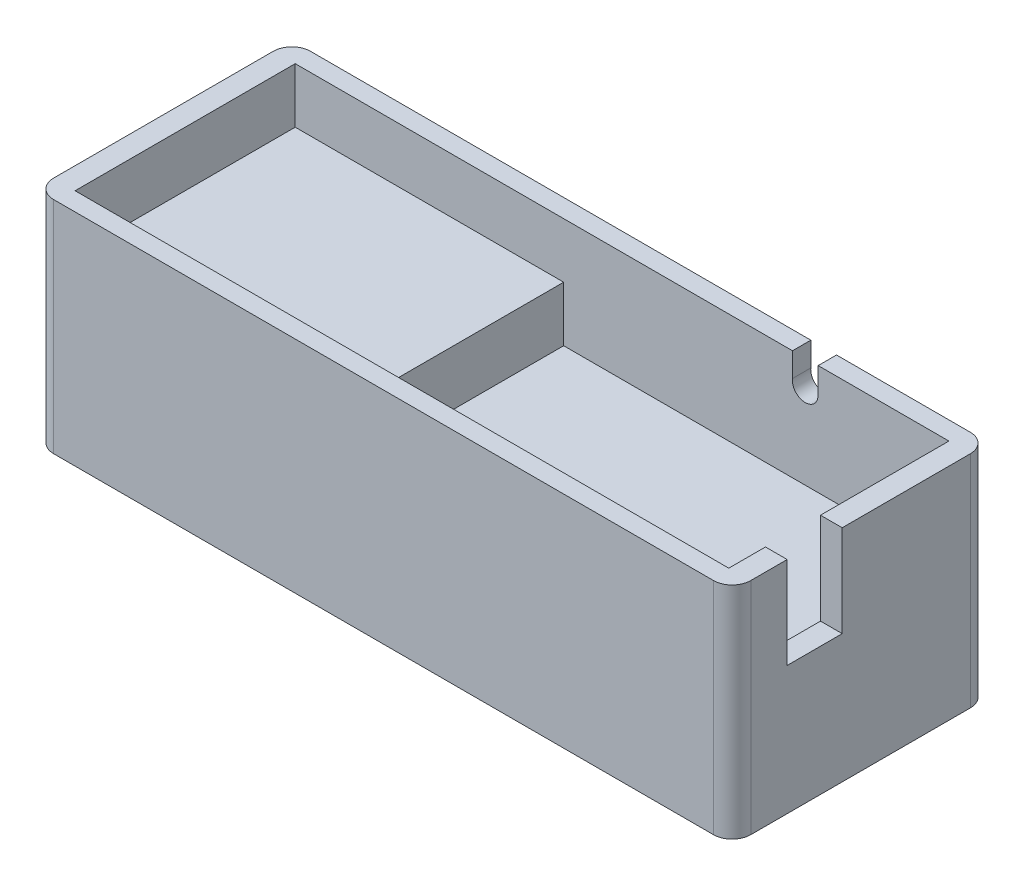
ISO-10303-21;
HEADER;
FILE_DESCRIPTION(('STEP AP214'),'2;1');
FILE_NAME('part.step','',(''),(''),'','','');
FILE_SCHEMA(('AUTOMOTIVE_DESIGN { 1 0 10303 214 1 1 1 1 }'));
ENDSEC;
DATA;
#1=APPLICATION_CONTEXT('core data for automotive mechanical design processes');
#2=APPLICATION_PROTOCOL_DEFINITION('international standard','automotive_design',2000,#1);
#3=PRODUCT_CONTEXT('',#1,'mechanical');
#4=PRODUCT('Part','Part','',(#3));
#5=PRODUCT_RELATED_PRODUCT_CATEGORY('part','',(#4));
#6=PRODUCT_DEFINITION_FORMATION('','',#4);
#7=PRODUCT_DEFINITION_CONTEXT('part definition',#1,'design');
#8=PRODUCT_DEFINITION('design','',#6,#7);
#9=PRODUCT_DEFINITION_SHAPE('','',#8);
#10=(LENGTH_UNIT() NAMED_UNIT(*) SI_UNIT(.MILLI.,.METRE.));
#11=(NAMED_UNIT(*) PLANE_ANGLE_UNIT() SI_UNIT($,.RADIAN.));
#12=(NAMED_UNIT(*) SI_UNIT($,.STERADIAN.) SOLID_ANGLE_UNIT());
#13=UNCERTAINTY_MEASURE_WITH_UNIT(LENGTH_MEASURE(1.E-05),#10,'distance_accuracy_value','');
#14=(GEOMETRIC_REPRESENTATION_CONTEXT(3) GLOBAL_UNCERTAINTY_ASSIGNED_CONTEXT((#13)) GLOBAL_UNIT_ASSIGNED_CONTEXT((#10,
#11,#12)) REPRESENTATION_CONTEXT('',''));
#15=CARTESIAN_POINT('',(0.,0.,0.));
#16=DIRECTION('',(0.,0.,1.));
#17=DIRECTION('',(1.,0.,0.));
#18=AXIS2_PLACEMENT_3D('',#15,#16,#17);
#19=CARTESIAN_POINT('',(-89.0845522238805,9.99999999999999,30.));
#20=DIRECTION('',(0.,0.,1.));
#21=DIRECTION('',(1.,0.,0.));
#22=AXIS2_PLACEMENT_3D('',#19,#20,#21);
#23=PLANE('',#22);
#24=DIRECTION('',(0.,-1.,0.));
#25=VECTOR('',#24,1.);
#26=CARTESIAN_POINT('',(-15.9154477761194,45.,30.));
#27=LINE('',#26,#25);
#28=CARTESIAN_POINT('',(-15.9154477761194,45.,30.));
#29=VERTEX_POINT('',#28);
#30=CARTESIAN_POINT('',(-15.9154477761194,30.,30.));
#31=VERTEX_POINT('',#30);
#32=EDGE_CURVE('E50',#29,#31,#27,.T.);
#33=ORIENTED_EDGE('',*,*,#32,.F.);
#34=DIRECTION('',(1.,0.,0.));
#35=VECTOR('',#34,1.);
#36=CARTESIAN_POINT('',(-89.0845522238805,45.,30.));
#37=LINE('',#36,#35);
#38=CARTESIAN_POINT('',(-89.0845522238805,45.,30.));
#39=VERTEX_POINT('',#38);
#40=EDGE_CURVE('E257',#39,#29,#37,.T.);
#41=ORIENTED_EDGE('',*,*,#40,.F.);
#42=DIRECTION('',(0.,1.,0.));
#43=VECTOR('',#42,1.);
#44=CARTESIAN_POINT('',(-89.0845522238805,9.99999999999999,30.));
#45=LINE('',#44,#43);
#46=CARTESIAN_POINT('',(-89.0845522238805,60.,30.));
#47=VERTEX_POINT('',#46);
#48=EDGE_CURVE('E267',#39,#47,#45,.T.);
#49=ORIENTED_EDGE('',*,*,#48,.T.);
#50=DIRECTION('',(1.,0.,0.));
#51=VECTOR('',#50,1.);
#52=CARTESIAN_POINT('',(-89.0845522238805,60.,30.));
#53=LINE('',#52,#51);
#54=CARTESIAN_POINT('',(89.0845522238806,60.,30.));
#55=VERTEX_POINT('',#54);
#56=EDGE_CURVE('E287',#47,#55,#53,.T.);
#57=ORIENTED_EDGE('',*,*,#56,.T.);
#58=DIRECTION('',(0.,1.,0.));
#59=VECTOR('',#58,1.);
#60=CARTESIAN_POINT('',(89.0845522238806,9.99999999999999,30.));
#61=LINE('',#60,#59);
#62=CARTESIAN_POINT('',(89.0845522238806,30.,30.));
#63=VERTEX_POINT('',#62);
#64=EDGE_CURVE('E276',#63,#55,#61,.T.);
#65=ORIENTED_EDGE('',*,*,#64,.F.);
#66=DIRECTION('',(1.,0.,0.));
#67=VECTOR('',#66,1.);
#68=CARTESIAN_POINT('',(89.0845522238806,30.,30.));
#69=LINE('',#68,#67);
#70=CARTESIAN_POINT('',(8.25151735382582,30.,30.));
#71=VERTEX_POINT('',#70);
#72=EDGE_CURVE('E479',#71,#63,#69,.T.);
#73=ORIENTED_EDGE('',*,*,#72,.F.);
#74=DIRECTION('',(0.,1.,0.));
#75=VECTOR('',#74,1.);
#76=CARTESIAN_POINT('',(8.25151735382582,9.99999999999999,30.));
#77=LINE('',#76,#75);
#78=CARTESIAN_POINT('',(8.25151735382582,43.6453957438315,30.));
#79=VERTEX_POINT('',#78);
#80=EDGE_CURVE('E379',#71,#79,#77,.T.);
#81=ORIENTED_EDGE('',*,*,#80,.T.);
#82=DIRECTION('',(-1.,0.,0.));
#83=VECTOR('',#82,1.);
#84=CARTESIAN_POINT('',(-89.0845522238805,43.6453957438315,30.));
#85=LINE('',#84,#83);
#86=CARTESIAN_POINT('',(-13.0462053971087,43.6453957438315,30.));
#87=VERTEX_POINT('',#86);
#88=EDGE_CURVE('E11',#79,#87,#85,.T.);
#89=ORIENTED_EDGE('',*,*,#88,.T.);
#90=DIRECTION('',(0.,-1.,0.));
#91=VECTOR('',#90,1.);
#92=CARTESIAN_POINT('',(-13.0462053971087,9.99999999999999,30.));
#93=LINE('',#92,#91);
#94=CARTESIAN_POINT('',(-13.0462053971087,30.,30.));
#95=VERTEX_POINT('',#94);
#96=EDGE_CURVE('E389',#87,#95,#93,.T.);
#97=ORIENTED_EDGE('',*,*,#96,.T.);
#98=EDGE_CURVE('E394',#31,#95,#69,.T.);
#99=ORIENTED_EDGE('',*,*,#98,.F.);
#100=EDGE_LOOP('',(#33,#41,#49,#57,#65,#73,#81,#89,#97,#99));
#101=FACE_BOUND('',#100,.T.);
#102=ADVANCED_FACE('F35',(#101),#23,.F.);
#103=CARTESIAN_POINT('',(-89.0845522238805,9.99999999999999,-30.));
#104=DIRECTION('',(0.,0.,-1.));
#105=DIRECTION('',(-1.,0.,0.));
#106=AXIS2_PLACEMENT_3D('',#103,#104,#105);
#107=PLANE('',#106);
#108=DIRECTION('',(0.,-1.,0.));
#109=VECTOR('',#108,1.);
#110=CARTESIAN_POINT('',(-15.9154477761194,45.,-30.));
#111=LINE('',#110,#109);
#112=CARTESIAN_POINT('',(-15.9154477761194,45.,-30.));
#113=VERTEX_POINT('',#112);
#114=CARTESIAN_POINT('',(-15.9154477761194,30.,-30.));
#115=VERTEX_POINT('',#114);
#116=EDGE_CURVE('E509',#113,#115,#111,.T.);
#117=ORIENTED_EDGE('',*,*,#116,.T.);
#118=DIRECTION('',(-1.,0.,0.));
#119=VECTOR('',#118,1.);
#120=CARTESIAN_POINT('',(89.0845522238806,30.,-30.));
#121=LINE('',#120,#119);
#122=CARTESIAN_POINT('',(89.0845522238806,30.,-30.));
#123=VERTEX_POINT('',#122);
#124=EDGE_CURVE('E477',#123,#115,#121,.T.);
#125=ORIENTED_EDGE('',*,*,#124,.F.);
#126=DIRECTION('',(0.,1.,0.));
#127=VECTOR('',#126,1.);
#128=CARTESIAN_POINT('',(89.0845522238806,9.99999999999999,-30.));
#129=LINE('',#128,#127);
#130=CARTESIAN_POINT('',(89.0845522238806,60.,-30.));
#131=VERTEX_POINT('',#130);
#132=EDGE_CURVE('E281',#123,#131,#129,.T.);
#133=ORIENTED_EDGE('',*,*,#132,.T.);
#134=DIRECTION('',(-1.,0.,0.));
#135=VECTOR('',#134,1.);
#136=CARTESIAN_POINT('',(-89.0845522238805,60.,-30.));
#137=LINE('',#136,#135);
#138=CARTESIAN_POINT('',(53.4495066360603,60.,-30.));
#139=VERTEX_POINT('',#138);
#140=EDGE_CURVE('E487',#131,#139,#137,.T.);
#141=ORIENTED_EDGE('',*,*,#140,.T.);
#142=DIRECTION('',(0.,1.,0.));
#143=VECTOR('',#142,1.);
#144=CARTESIAN_POINT('',(53.4495066360603,53.0700154630988,-30.));
#145=LINE('',#144,#143);
#146=CARTESIAN_POINT('',(53.4495066360603,53.0700154630988,-30.));
#147=VERTEX_POINT('',#146);
#148=EDGE_CURVE('E447',#147,#139,#145,.T.);
#149=ORIENTED_EDGE('',*,*,#148,.F.);
#150=DIRECTION('',(1.,0.,0.));
#151=VECTOR('',#150,1.);
#152=CARTESIAN_POINT('',(53.4495066360603,53.0700154630988,-30.));
#153=LINE('',#152,#151);
#154=CARTESIAN_POINT('',(53.419299620628,53.0700154630988,-30.));
#155=VERTEX_POINT('',#154);
#156=EDGE_CURVE('E442',#155,#147,#153,.T.);
#157=ORIENTED_EDGE('',*,*,#156,.F.);
#158=CARTESIAN_POINT('',(49.92,53.,-30.));
#159=DIRECTION('',(0.,0.,-1.));
#160=DIRECTION('',(-1.,0.,0.));
#161=AXIS2_PLACEMENT_3D('',#158,#159,#160);
#162=CIRCLE('',#161,3.5);
#163=CARTESIAN_POINT('',(46.4495066360603,53.4535149510773,-30.));
#164=VERTEX_POINT('',#163);
#165=EDGE_CURVE('E352',#155,#164,#162,.T.);
#166=ORIENTED_EDGE('',*,*,#165,.T.);
#167=DIRECTION('',(0.,1.,0.));
#168=VECTOR('',#167,1.);
#169=CARTESIAN_POINT('',(46.4495066360603,53.0700154630988,-30.));
#170=LINE('',#169,#168);
#171=CARTESIAN_POINT('',(46.4495066360603,60.,-30.));
#172=VERTEX_POINT('',#171);
#173=EDGE_CURVE('E450',#164,#172,#170,.T.);
#174=ORIENTED_EDGE('',*,*,#173,.T.);
#175=CARTESIAN_POINT('',(-89.0845522238805,60.,-30.));
#176=VERTEX_POINT('',#175);
#177=EDGE_CURVE('E486',#172,#176,#137,.T.);
#178=ORIENTED_EDGE('',*,*,#177,.T.);
#179=DIRECTION('',(0.,1.,0.));
#180=VECTOR('',#179,1.);
#181=CARTESIAN_POINT('',(-89.0845522238805,9.99999999999999,-30.));
#182=LINE('',#181,#180);
#183=CARTESIAN_POINT('',(-89.0845522238805,45.,-30.));
#184=VERTEX_POINT('',#183);
#185=EDGE_CURVE('E277',#184,#176,#182,.T.);
#186=ORIENTED_EDGE('',*,*,#185,.F.);
#187=DIRECTION('',(-1.,0.,0.));
#188=VECTOR('',#187,1.);
#189=CARTESIAN_POINT('',(-89.0845522238805,45.,-30.));
#190=LINE('',#189,#188);
#191=EDGE_CURVE('E259',#113,#184,#190,.T.);
#192=ORIENTED_EDGE('',*,*,#191,.F.);
#193=EDGE_LOOP('',(#117,#125,#133,#141,#149,#157,#166,#174,#178,#186,#192));
#194=FACE_BOUND('',#193,.T.);
#195=ADVANCED_FACE('F506',(#194),#107,.F.);
#196=CARTESIAN_POINT('',(0.,30.,0.));
#197=DIRECTION('',(0.,1.,0.));
#198=DIRECTION('',(0.,0.,1.));
#199=AXIS2_PLACEMENT_3D('',#196,#197,#198);
#200=PLANE('',#199);
#201=ORIENTED_EDGE('',*,*,#124,.T.);
#202=DIRECTION('',(0.,0.,-1.));
#203=VECTOR('',#202,1.);
#204=CARTESIAN_POINT('',(-15.9154477761194,30.,-30.));
#205=LINE('',#204,#203);
#206=EDGE_CURVE('E263',#31,#115,#205,.T.);
#207=ORIENTED_EDGE('',*,*,#206,.F.);
#208=ORIENTED_EDGE('',*,*,#98,.T.);
#209=DIRECTION('',(0.,0.,1.));
#210=VECTOR('',#209,1.);
#211=CARTESIAN_POINT('',(-13.0462053971087,30.,0.));
#212=LINE('',#211,#210);
#213=CARTESIAN_POINT('',(-13.0462053971087,30.,26.2840322014641));
#214=VERTEX_POINT('',#213);
#215=EDGE_CURVE('E364',#214,#95,#212,.T.);
#216=ORIENTED_EDGE('',*,*,#215,.F.);
#217=DIRECTION('',(-1.,0.,0.));
#218=VECTOR('',#217,1.);
#219=CARTESIAN_POINT('',(0.,30.,26.2840322014641));
#220=LINE('',#219,#218);
#221=CARTESIAN_POINT('',(8.25151735382582,30.,26.2840322014641));
#222=VERTEX_POINT('',#221);
#223=EDGE_CURVE('E367',#222,#214,#220,.T.);
#224=ORIENTED_EDGE('',*,*,#223,.F.);
#225=DIRECTION('',(0.,0.,-1.));
#226=VECTOR('',#225,1.);
#227=CARTESIAN_POINT('',(8.25151735382581,30.,0.));
#228=LINE('',#227,#226);
#229=EDGE_CURVE('E43',#71,#222,#228,.T.);
#230=ORIENTED_EDGE('',*,*,#229,.F.);
#231=ORIENTED_EDGE('',*,*,#72,.T.);
#232=DIRECTION('',(0.,0.,-1.));
#233=VECTOR('',#232,1.);
#234=CARTESIAN_POINT('',(89.0845522238806,30.,30.));
#235=LINE('',#234,#233);
#236=EDGE_CURVE('E475',#63,#123,#235,.T.);
#237=ORIENTED_EDGE('',*,*,#236,.T.);
#238=EDGE_LOOP('',(#201,#207,#208,#216,#224,#230,#231,#237));
#239=FACE_BOUND('',#238,.T.);
#240=ADVANCED_FACE('F393',(#239),#200,.T.);
#241=CARTESIAN_POINT('',(0.,60.,0.));
#242=DIRECTION('',(0.,1.,0.));
#243=DIRECTION('',(0.,0.,1.));
#244=AXIS2_PLACEMENT_3D('',#241,#242,#243);
#245=PLANE('',#244);
#246=DIRECTION('',(0.,0.,-1.));
#247=VECTOR('',#246,1.);
#248=CARTESIAN_POINT('',(53.4495066360603,60.,-30.));
#249=LINE('',#248,#247);
#250=CARTESIAN_POINT('',(53.4495066360603,60.,-35.));
#251=VERTEX_POINT('',#250);
#252=EDGE_CURVE('E429',#139,#251,#249,.T.);
#253=ORIENTED_EDGE('',*,*,#252,.F.);
#254=ORIENTED_EDGE('',*,*,#140,.F.);
#255=DIRECTION('',(0.,0.,-1.));
#256=VECTOR('',#255,1.);
#257=CARTESIAN_POINT('',(89.0845522238806,60.,30.));
#258=LINE('',#257,#256);
#259=CARTESIAN_POINT('',(89.0845522238806,60.,5.));
#260=VERTEX_POINT('',#259);
#261=EDGE_CURVE('E355',#260,#131,#258,.T.);
#262=ORIENTED_EDGE('',*,*,#261,.F.);
#263=DIRECTION('',(-1.,0.,0.));
#264=VECTOR('',#263,1.);
#265=CARTESIAN_POINT('',(0.,60.,5.));
#266=LINE('',#265,#264);
#267=CARTESIAN_POINT('',(95.,60.,5.));
#268=VERTEX_POINT('',#267);
#269=EDGE_CURVE('E471',#268,#260,#266,.T.);
#270=ORIENTED_EDGE('',*,*,#269,.F.);
#271=DIRECTION('',(0.,0.,1.));
#272=VECTOR('',#271,1.);
#273=CARTESIAN_POINT('',(95.,60.,-35.));
#274=LINE('',#273,#272);
#275=CARTESIAN_POINT('',(95.,60.,-29.92));
#276=VERTEX_POINT('',#275);
#277=EDGE_CURVE('E296',#276,#268,#274,.T.);
#278=ORIENTED_EDGE('',*,*,#277,.F.);
#279=CARTESIAN_POINT('',(89.92,60.,-29.92));
#280=DIRECTION('',(0.,1.,0.));
#281=DIRECTION('',(0.,0.,1.));
#282=AXIS2_PLACEMENT_3D('',#279,#280,#281);
#283=CIRCLE('',#282,5.08);
#284=CARTESIAN_POINT('',(89.92,60.,-35.));
#285=VERTEX_POINT('',#284);
#286=EDGE_CURVE('E333',#276,#285,#283,.T.);
#287=ORIENTED_EDGE('',*,*,#286,.T.);
#288=DIRECTION('',(1.,0.,0.));
#289=VECTOR('',#288,1.);
#290=CARTESIAN_POINT('',(-95.,60.,-35.));
#291=LINE('',#290,#289);
#292=EDGE_CURVE('E299',#251,#285,#291,.T.);
#293=ORIENTED_EDGE('',*,*,#292,.F.);
#294=EDGE_LOOP('',(#253,#254,#262,#270,#278,#287,#293));
#295=FACE_BOUND('',#294,.T.);
#296=ADVANCED_FACE('F615',(#295),#245,.T.);
#297=CARTESIAN_POINT('',(-95.,60.,-35.));
#298=DIRECTION('',(1.,0.,0.));
#299=DIRECTION('',(0.,0.,-1.));
#300=AXIS2_PLACEMENT_3D('',#297,#298,#299);
#301=PLANE('',#300);
#302=DIRECTION('',(0.,0.,1.));
#303=VECTOR('',#302,1.);
#304=CARTESIAN_POINT('',(-95.,0.,-35.));
#305=LINE('',#304,#303);
#306=CARTESIAN_POINT('',(-95.,0.,-29.92));
#307=VERTEX_POINT('',#306);
#308=CARTESIAN_POINT('',(-95.,0.,29.92));
#309=VERTEX_POINT('',#308);
#310=EDGE_CURVE('E279',#307,#309,#305,.T.);
#311=ORIENTED_EDGE('',*,*,#310,.T.);
#312=DIRECTION('',(0.,-1.,0.));
#313=VECTOR('',#312,1.);
#314=CARTESIAN_POINT('',(-95.,60.,29.92));
#315=LINE('',#314,#313);
#316=CARTESIAN_POINT('',(-95.,60.,29.92));
#317=VERTEX_POINT('',#316);
#318=EDGE_CURVE('E329',#309,#317,#315,.F.);
#319=ORIENTED_EDGE('',*,*,#318,.T.);
#320=DIRECTION('',(0.,0.,1.));
#321=VECTOR('',#320,1.);
#322=CARTESIAN_POINT('',(-95.,60.,-35.));
#323=LINE('',#322,#321);
#324=CARTESIAN_POINT('',(-95.,60.,-29.92));
#325=VERTEX_POINT('',#324);
#326=EDGE_CURVE('E288',#325,#317,#323,.T.);
#327=ORIENTED_EDGE('',*,*,#326,.F.);
#328=DIRECTION('',(0.,-1.,0.));
#329=VECTOR('',#328,1.);
#330=CARTESIAN_POINT('',(-95.,0.,-29.92));
#331=LINE('',#330,#329);
#332=EDGE_CURVE('E326',#325,#307,#331,.T.);
#333=ORIENTED_EDGE('',*,*,#332,.T.);
#334=EDGE_LOOP('',(#311,#319,#327,#333));
#335=FACE_BOUND('',#334,.T.);
#336=ADVANCED_FACE('F580',(#335),#301,.F.);
#337=CARTESIAN_POINT('',(-95.,60.,35.));
#338=DIRECTION('',(0.,0.,-1.));
#339=DIRECTION('',(-1.,0.,0.));
#340=AXIS2_PLACEMENT_3D('',#337,#338,#339);
#341=PLANE('',#340);
#342=DIRECTION('',(1.,0.,0.));
#343=VECTOR('',#342,1.);
#344=CARTESIAN_POINT('',(-95.,60.,35.));
#345=LINE('',#344,#343);
#346=CARTESIAN_POINT('',(-89.92,60.,35.));
#347=VERTEX_POINT('',#346);
#348=CARTESIAN_POINT('',(89.92,60.,35.));
#349=VERTEX_POINT('',#348);
#350=EDGE_CURVE('E291',#347,#349,#345,.T.);
#351=ORIENTED_EDGE('',*,*,#350,.F.);
#352=DIRECTION('',(0.,-1.,0.));
#353=VECTOR('',#352,1.);
#354=CARTESIAN_POINT('',(-89.92,60.,35.));
#355=LINE('',#354,#353);
#356=CARTESIAN_POINT('',(-89.92,0.,35.));
#357=VERTEX_POINT('',#356);
#358=EDGE_CURVE('E315',#347,#357,#355,.T.);
#359=ORIENTED_EDGE('',*,*,#358,.T.);
#360=DIRECTION('',(1.,0.,0.));
#361=VECTOR('',#360,1.);
#362=CARTESIAN_POINT('',(-95.,0.,35.));
#363=LINE('',#362,#361);
#364=CARTESIAN_POINT('',(89.92,0.,35.));
#365=VERTEX_POINT('',#364);
#366=EDGE_CURVE('E306',#357,#365,#363,.T.);
#367=ORIENTED_EDGE('',*,*,#366,.T.);
#368=DIRECTION('',(0.,-1.,0.));
#369=VECTOR('',#368,1.);
#370=CARTESIAN_POINT('',(89.92,60.,35.));
#371=LINE('',#370,#369);
#372=EDGE_CURVE('E303',#365,#349,#371,.F.);
#373=ORIENTED_EDGE('',*,*,#372,.T.);
#374=EDGE_LOOP('',(#351,#359,#367,#373));
#375=FACE_BOUND('',#374,.T.);
#376=ADVANCED_FACE('F568',(#375),#341,.F.);
#377=CARTESIAN_POINT('',(95.,60.,-35.));
#378=DIRECTION('',(1.,0.,0.));
#379=DIRECTION('',(0.,0.,-1.));
#380=AXIS2_PLACEMENT_3D('',#377,#378,#379);
#381=PLANE('',#380);
#382=DIRECTION('',(0.,1.,0.));
#383=VECTOR('',#382,1.);
#384=CARTESIAN_POINT('',(95.,60.,5.));
#385=LINE('',#384,#383);
#386=CARTESIAN_POINT('',(95.,35.,5.));
#387=VERTEX_POINT('',#386);
#388=EDGE_CURVE('E473',#387,#268,#385,.T.);
#389=ORIENTED_EDGE('',*,*,#388,.F.);
#390=DIRECTION('',(0.,0.,-1.));
#391=VECTOR('',#390,1.);
#392=CARTESIAN_POINT('',(95.,35.,-35.));
#393=LINE('',#392,#391);
#394=CARTESIAN_POINT('',(95.,35.,20.));
#395=VERTEX_POINT('',#394);
#396=EDGE_CURVE('E464',#395,#387,#393,.T.);
#397=ORIENTED_EDGE('',*,*,#396,.F.);
#398=DIRECTION('',(0.,-1.,0.));
#399=VECTOR('',#398,1.);
#400=CARTESIAN_POINT('',(95.,60.,20.));
#401=LINE('',#400,#399);
#402=CARTESIAN_POINT('',(95.,60.,20.));
#403=VERTEX_POINT('',#402);
#404=EDGE_CURVE('E469',#403,#395,#401,.T.);
#405=ORIENTED_EDGE('',*,*,#404,.F.);
#406=CARTESIAN_POINT('',(95.,60.,29.92));
#407=VERTEX_POINT('',#406);
#408=EDGE_CURVE('E295',#403,#407,#274,.T.);
#409=ORIENTED_EDGE('',*,*,#408,.T.);
#410=DIRECTION('',(0.,-1.,0.));
#411=VECTOR('',#410,1.);
#412=CARTESIAN_POINT('',(95.,0.,29.92));
#413=LINE('',#412,#411);
#414=CARTESIAN_POINT('',(95.,0.,29.92));
#415=VERTEX_POINT('',#414);
#416=EDGE_CURVE('E343',#407,#415,#413,.T.);
#417=ORIENTED_EDGE('',*,*,#416,.T.);
#418=DIRECTION('',(0.,0.,1.));
#419=VECTOR('',#418,1.);
#420=CARTESIAN_POINT('',(95.,0.,-35.));
#421=LINE('',#420,#419);
#422=CARTESIAN_POINT('',(95.,0.,-29.92));
#423=VERTEX_POINT('',#422);
#424=EDGE_CURVE('E309',#423,#415,#421,.T.);
#425=ORIENTED_EDGE('',*,*,#424,.F.);
#426=DIRECTION('',(0.,-1.,0.));
#427=VECTOR('',#426,1.);
#428=CARTESIAN_POINT('',(95.,60.,-29.92));
#429=LINE('',#428,#427);
#430=EDGE_CURVE('E341',#423,#276,#429,.F.);
#431=ORIENTED_EDGE('',*,*,#430,.T.);
#432=ORIENTED_EDGE('',*,*,#277,.T.);
#433=EDGE_LOOP('',(#389,#397,#405,#409,#417,#425,#431,#432));
#434=FACE_BOUND('',#433,.T.);
#435=ADVANCED_FACE('F599',(#434),#381,.T.);
#436=CARTESIAN_POINT('',(-95.,60.,-35.));
#437=DIRECTION('',(0.,0.,-1.));
#438=DIRECTION('',(-1.,0.,0.));
#439=AXIS2_PLACEMENT_3D('',#436,#437,#438);
#440=PLANE('',#439);
#441=DIRECTION('',(0.,1.,0.));
#442=VECTOR('',#441,1.);
#443=CARTESIAN_POINT('',(46.4495066360603,53.0700154630988,-35.));
#444=LINE('',#443,#442);
#445=CARTESIAN_POINT('',(46.4495066360603,53.4535149510773,-35.));
#446=VERTEX_POINT('',#445);
#447=CARTESIAN_POINT('',(46.4495066360603,60.,-35.));
#448=VERTEX_POINT('',#447);
#449=EDGE_CURVE('E453',#446,#448,#444,.T.);
#450=ORIENTED_EDGE('',*,*,#449,.F.);
#451=CARTESIAN_POINT('',(49.92,53.,-35.));
#452=DIRECTION('',(0.,0.,-1.));
#453=DIRECTION('',(-1.,0.,0.));
#454=AXIS2_PLACEMENT_3D('',#451,#452,#453);
#455=CIRCLE('',#454,3.5);
#456=CARTESIAN_POINT('',(53.419299620628,53.0700154630988,-35.));
#457=VERTEX_POINT('',#456);
#458=EDGE_CURVE('E356',#457,#446,#455,.T.);
#459=ORIENTED_EDGE('',*,*,#458,.F.);
#460=DIRECTION('',(-1.,0.,0.));
#461=VECTOR('',#460,1.);
#462=CARTESIAN_POINT('',(53.4495066360603,53.0700154630988,-35.));
#463=LINE('',#462,#461);
#464=CARTESIAN_POINT('',(53.4495066360603,53.0700154630988,-35.));
#465=VERTEX_POINT('',#464);
#466=EDGE_CURVE('E439',#465,#457,#463,.T.);
#467=ORIENTED_EDGE('',*,*,#466,.F.);
#468=DIRECTION('',(0.,1.,0.));
#469=VECTOR('',#468,1.);
#470=CARTESIAN_POINT('',(53.4495066360603,53.0700154630988,-35.));
#471=LINE('',#470,#469);
#472=EDGE_CURVE('E444',#465,#251,#471,.T.);
#473=ORIENTED_EDGE('',*,*,#472,.T.);
#474=ORIENTED_EDGE('',*,*,#292,.T.);
#475=DIRECTION('',(0.,-1.,0.));
#476=VECTOR('',#475,1.);
#477=CARTESIAN_POINT('',(89.92,60.,-35.));
#478=LINE('',#477,#476);
#479=CARTESIAN_POINT('',(89.92,0.,-35.));
#480=VERTEX_POINT('',#479);
#481=EDGE_CURVE('E348',#285,#480,#478,.T.);
#482=ORIENTED_EDGE('',*,*,#481,.T.);
#483=DIRECTION('',(1.,0.,0.));
#484=VECTOR('',#483,1.);
#485=CARTESIAN_POINT('',(-95.,0.,-35.));
#486=LINE('',#485,#484);
#487=CARTESIAN_POINT('',(-89.92,0.,-35.));
#488=VERTEX_POINT('',#487);
#489=EDGE_CURVE('E292',#488,#480,#486,.T.);
#490=ORIENTED_EDGE('',*,*,#489,.F.);
#491=DIRECTION('',(0.,-1.,0.));
#492=VECTOR('',#491,1.);
#493=CARTESIAN_POINT('',(-89.92,60.,-35.));
#494=LINE('',#493,#492);
#495=CARTESIAN_POINT('',(-89.92,60.,-35.));
#496=VERTEX_POINT('',#495);
#497=EDGE_CURVE('E346',#488,#496,#494,.F.);
#498=ORIENTED_EDGE('',*,*,#497,.T.);
#499=EDGE_CURVE('E300',#496,#448,#291,.T.);
#500=ORIENTED_EDGE('',*,*,#499,.T.);
#501=EDGE_LOOP('',(#450,#459,#467,#473,#474,#482,#490,#498,#500));
#502=FACE_BOUND('',#501,.T.);
#503=ADVANCED_FACE('F589',(#502),#440,.T.);
#504=DIRECTION('',(0.,0.,1.));
#505=VECTOR('',#504,1.);
#506=CARTESIAN_POINT('',(46.4495066360603,60.,-30.));
#507=LINE('',#506,#505);
#508=EDGE_CURVE('E440',#448,#172,#507,.T.);
#509=ORIENTED_EDGE('',*,*,#508,.F.);
#510=ORIENTED_EDGE('',*,*,#499,.F.);
#511=CARTESIAN_POINT('',(-89.92,60.,-29.92));
#512=DIRECTION('',(0.,1.,0.));
#513=DIRECTION('',(0.,0.,1.));
#514=AXIS2_PLACEMENT_3D('',#511,#512,#513);
#515=CIRCLE('',#514,5.08);
#516=EDGE_CURVE('E331',#496,#325,#515,.T.);
#517=ORIENTED_EDGE('',*,*,#516,.T.);
#518=ORIENTED_EDGE('',*,*,#326,.T.);
#519=CARTESIAN_POINT('',(-89.92,60.,29.92));
#520=DIRECTION('',(0.,1.,0.));
#521=DIRECTION('',(0.,0.,1.));
#522=AXIS2_PLACEMENT_3D('',#519,#520,#521);
#523=CIRCLE('',#522,5.08);
#524=EDGE_CURVE('E339',#317,#347,#523,.T.);
#525=ORIENTED_EDGE('',*,*,#524,.T.);
#526=ORIENTED_EDGE('',*,*,#350,.T.);
#527=CARTESIAN_POINT('',(89.92,60.,29.92));
#528=DIRECTION('',(0.,1.,0.));
#529=DIRECTION('',(0.,0.,1.));
#530=AXIS2_PLACEMENT_3D('',#527,#528,#529);
#531=CIRCLE('',#530,5.08);
#532=EDGE_CURVE('E336',#349,#407,#531,.T.);
#533=ORIENTED_EDGE('',*,*,#532,.T.);
#534=ORIENTED_EDGE('',*,*,#408,.F.);
#535=DIRECTION('',(1.,0.,0.));
#536=VECTOR('',#535,1.);
#537=CARTESIAN_POINT('',(0.,60.,20.));
#538=LINE('',#537,#536);
#539=CARTESIAN_POINT('',(89.0845522238806,60.,20.));
#540=VERTEX_POINT('',#539);
#541=EDGE_CURVE('E467',#540,#403,#538,.T.);
#542=ORIENTED_EDGE('',*,*,#541,.F.);
#543=EDGE_CURVE('E483',#55,#540,#258,.T.);
#544=ORIENTED_EDGE('',*,*,#543,.F.);
#545=ORIENTED_EDGE('',*,*,#56,.F.);
#546=DIRECTION('',(0.,0.,1.));
#547=VECTOR('',#546,1.);
#548=CARTESIAN_POINT('',(-89.0845522238805,60.,30.));
#549=LINE('',#548,#547);
#550=EDGE_CURVE('E274',#176,#47,#549,.T.);
#551=ORIENTED_EDGE('',*,*,#550,.F.);
#552=ORIENTED_EDGE('',*,*,#177,.F.);
#553=EDGE_LOOP('',(#509,#510,#517,#518,#525,#526,#533,#534,#542,#544,#545,#551,#552));
#554=FACE_BOUND('',#553,.T.);
#555=ADVANCED_FACE('F495',(#554),#245,.T.);
#556=CARTESIAN_POINT('',(0.,0.,0.));
#557=DIRECTION('',(0.,1.,0.));
#558=DIRECTION('',(0.,0.,1.));
#559=AXIS2_PLACEMENT_3D('',#556,#557,#558);
#560=PLANE('',#559);
#561=DIRECTION('',(1.,0.,0.));
#562=VECTOR('',#561,1.);
#563=CARTESIAN_POINT('',(-82.7484826461742,0.,-29.5));
#564=LINE('',#563,#562);
#565=CARTESIAN_POINT('',(-82.7484826461742,0.,-29.5));
#566=VERTEX_POINT('',#565);
#567=CARTESIAN_POINT('',(8.25151735382582,0.,-29.5));
#568=VERTEX_POINT('',#567);
#569=EDGE_CURVE('E420',#566,#568,#564,.T.);
#570=ORIENTED_EDGE('',*,*,#569,.F.);
#571=DIRECTION('',(0.,0.,-1.));
#572=VECTOR('',#571,1.);
#573=CARTESIAN_POINT('',(-82.7484826461742,0.,29.5));
#574=LINE('',#573,#572);
#575=CARTESIAN_POINT('',(-82.7484826461742,0.,29.5));
#576=VERTEX_POINT('',#575);
#577=EDGE_CURVE('E400',#576,#566,#574,.T.);
#578=ORIENTED_EDGE('',*,*,#577,.F.);
#579=DIRECTION('',(-1.,0.,0.));
#580=VECTOR('',#579,1.);
#581=CARTESIAN_POINT('',(-82.7484826461742,0.,29.5));
#582=LINE('',#581,#580);
#583=CARTESIAN_POINT('',(8.25151735382582,0.,29.5));
#584=VERTEX_POINT('',#583);
#585=EDGE_CURVE('E410',#584,#576,#582,.T.);
#586=ORIENTED_EDGE('',*,*,#585,.F.);
#587=DIRECTION('',(0.,0.,1.));
#588=VECTOR('',#587,1.);
#589=CARTESIAN_POINT('',(8.25151735382582,0.,29.5));
#590=LINE('',#589,#588);
#591=EDGE_CURVE('E423',#568,#584,#590,.T.);
#592=ORIENTED_EDGE('',*,*,#591,.F.);
#593=EDGE_LOOP('',(#570,#578,#586,#592));
#594=FACE_BOUND('',#593,.T.);
#595=ORIENTED_EDGE('',*,*,#366,.F.);
#596=CARTESIAN_POINT('',(-89.92,0.,29.92));
#597=DIRECTION('',(0.,1.,0.));
#598=DIRECTION('',(0.,0.,1.));
#599=AXIS2_PLACEMENT_3D('',#596,#597,#598);
#600=CIRCLE('',#599,5.08);
#601=EDGE_CURVE('E324',#357,#309,#600,.F.);
#602=ORIENTED_EDGE('',*,*,#601,.T.);
#603=ORIENTED_EDGE('',*,*,#310,.F.);
#604=CARTESIAN_POINT('',(-89.92,0.,-29.92));
#605=DIRECTION('',(0.,1.,0.));
#606=DIRECTION('',(0.,0.,1.));
#607=AXIS2_PLACEMENT_3D('',#604,#605,#606);
#608=CIRCLE('',#607,5.08);
#609=EDGE_CURVE('E318',#307,#488,#608,.F.);
#610=ORIENTED_EDGE('',*,*,#609,.T.);
#611=ORIENTED_EDGE('',*,*,#489,.T.);
#612=CARTESIAN_POINT('',(89.92,0.,-29.92));
#613=DIRECTION('',(0.,1.,0.));
#614=DIRECTION('',(0.,0.,1.));
#615=AXIS2_PLACEMENT_3D('',#612,#613,#614);
#616=CIRCLE('',#615,5.08);
#617=EDGE_CURVE('E320',#480,#423,#616,.F.);
#618=ORIENTED_EDGE('',*,*,#617,.T.);
#619=ORIENTED_EDGE('',*,*,#424,.T.);
#620=CARTESIAN_POINT('',(89.92,0.,29.92));
#621=DIRECTION('',(0.,1.,0.));
#622=DIRECTION('',(0.,0.,1.));
#623=AXIS2_PLACEMENT_3D('',#620,#621,#622);
#624=CIRCLE('',#623,5.08);
#625=EDGE_CURVE('E322',#415,#365,#624,.F.);
#626=ORIENTED_EDGE('',*,*,#625,.T.);
#627=EDGE_LOOP('',(#595,#602,#603,#610,#611,#618,#619,#626));
#628=FACE_BOUND('',#627,.T.);
#629=ADVANCED_FACE('F559',(#594,#628),#560,.F.);
#630=CARTESIAN_POINT('',(89.0845522238806,9.99999999999999,30.));
#631=DIRECTION('',(1.,0.,0.));
#632=DIRECTION('',(0.,0.,-1.));
#633=AXIS2_PLACEMENT_3D('',#630,#631,#632);
#634=PLANE('',#633);
#635=DIRECTION('',(0.,0.,1.));
#636=VECTOR('',#635,1.);
#637=CARTESIAN_POINT('',(89.0845522238806,35.,5.));
#638=LINE('',#637,#636);
#639=CARTESIAN_POINT('',(89.0845522238806,35.,5.));
#640=VERTEX_POINT('',#639);
#641=CARTESIAN_POINT('',(89.0845522238806,35.,20.));
#642=VERTEX_POINT('',#641);
#643=EDGE_CURVE('E449',#640,#642,#638,.T.);
#644=ORIENTED_EDGE('',*,*,#643,.F.);
#645=DIRECTION('',(0.,1.,0.));
#646=VECTOR('',#645,1.);
#647=CARTESIAN_POINT('',(89.0845522238806,9.99999999999999,5.));
#648=LINE('',#647,#646);
#649=EDGE_CURVE('E351',#640,#260,#648,.T.);
#650=ORIENTED_EDGE('',*,*,#649,.T.);
#651=ORIENTED_EDGE('',*,*,#261,.T.);
#652=ORIENTED_EDGE('',*,*,#132,.F.);
#653=ORIENTED_EDGE('',*,*,#236,.F.);
#654=ORIENTED_EDGE('',*,*,#64,.T.);
#655=ORIENTED_EDGE('',*,*,#543,.T.);
#656=DIRECTION('',(0.,1.,0.));
#657=VECTOR('',#656,1.);
#658=CARTESIAN_POINT('',(89.0845522238806,68.0200000000184,20.));
#659=LINE('',#658,#657);
#660=EDGE_CURVE('E459',#642,#540,#659,.T.);
#661=ORIENTED_EDGE('',*,*,#660,.F.);
#662=EDGE_LOOP('',(#644,#650,#651,#652,#653,#654,#655,#661));
#663=FACE_BOUND('',#662,.T.);
#664=ADVANCED_FACE('F500',(#663),#634,.F.);
#665=CARTESIAN_POINT('',(-89.0845522238805,9.99999999999999,30.));
#666=DIRECTION('',(-1.,0.,0.));
#667=DIRECTION('',(0.,0.,1.));
#668=AXIS2_PLACEMENT_3D('',#665,#666,#667);
#669=PLANE('',#668);
#670=ORIENTED_EDGE('',*,*,#48,.F.);
#671=DIRECTION('',(0.,0.,1.));
#672=VECTOR('',#671,1.);
#673=CARTESIAN_POINT('',(-89.0845522238805,45.,-30.));
#674=LINE('',#673,#672);
#675=EDGE_CURVE('E254',#184,#39,#674,.T.);
#676=ORIENTED_EDGE('',*,*,#675,.F.);
#677=ORIENTED_EDGE('',*,*,#185,.T.);
#678=ORIENTED_EDGE('',*,*,#550,.T.);
#679=EDGE_LOOP('',(#670,#676,#677,#678));
#680=FACE_BOUND('',#679,.T.);
#681=ADVANCED_FACE('F272',(#680),#669,.F.);
#682=CARTESIAN_POINT('',(-89.92,60.,29.92));
#683=DIRECTION('',(0.,-1.,0.));
#684=DIRECTION('',(0.,0.,-1.));
#685=AXIS2_PLACEMENT_3D('',#682,#683,#684);
#686=CYLINDRICAL_SURFACE('',#685,5.08);
#687=ORIENTED_EDGE('',*,*,#524,.F.);
#688=ORIENTED_EDGE('',*,*,#318,.F.);
#689=ORIENTED_EDGE('',*,*,#601,.F.);
#690=ORIENTED_EDGE('',*,*,#358,.F.);
#691=EDGE_LOOP('',(#687,#688,#689,#690));
#692=FACE_BOUND('',#691,.T.);
#693=ADVANCED_FACE('F576',(#692),#686,.T.);
#694=CARTESIAN_POINT('',(89.92,60.,29.92));
#695=DIRECTION('',(0.,1.,0.));
#696=DIRECTION('',(0.,0.,1.));
#697=AXIS2_PLACEMENT_3D('',#694,#695,#696);
#698=CYLINDRICAL_SURFACE('',#697,5.08);
#699=ORIENTED_EDGE('',*,*,#532,.F.);
#700=ORIENTED_EDGE('',*,*,#372,.F.);
#701=ORIENTED_EDGE('',*,*,#625,.F.);
#702=ORIENTED_EDGE('',*,*,#416,.F.);
#703=EDGE_LOOP('',(#699,#700,#701,#702));
#704=FACE_BOUND('',#703,.T.);
#705=ADVANCED_FACE('F572',(#704),#698,.T.);
#706=CARTESIAN_POINT('',(89.92,60.,-29.92));
#707=DIRECTION('',(0.,-1.,0.));
#708=DIRECTION('',(0.,0.,-1.));
#709=AXIS2_PLACEMENT_3D('',#706,#707,#708);
#710=CYLINDRICAL_SURFACE('',#709,5.08);
#711=ORIENTED_EDGE('',*,*,#286,.F.);
#712=ORIENTED_EDGE('',*,*,#430,.F.);
#713=ORIENTED_EDGE('',*,*,#617,.F.);
#714=ORIENTED_EDGE('',*,*,#481,.F.);
#715=EDGE_LOOP('',(#711,#712,#713,#714));
#716=FACE_BOUND('',#715,.T.);
#717=ADVANCED_FACE('F594',(#716),#710,.T.);
#718=CARTESIAN_POINT('',(-89.92,60.,-29.92));
#719=DIRECTION('',(0.,1.,0.));
#720=DIRECTION('',(0.,0.,1.));
#721=AXIS2_PLACEMENT_3D('',#718,#719,#720);
#722=CYLINDRICAL_SURFACE('',#721,5.08);
#723=ORIENTED_EDGE('',*,*,#516,.F.);
#724=ORIENTED_EDGE('',*,*,#497,.F.);
#725=ORIENTED_EDGE('',*,*,#609,.F.);
#726=ORIENTED_EDGE('',*,*,#332,.F.);
#727=EDGE_LOOP('',(#723,#724,#725,#726));
#728=FACE_BOUND('',#727,.T.);
#729=ADVANCED_FACE('F37',(#728),#722,.T.);
#730=CARTESIAN_POINT('',(49.92,53.,-23.789093369307));
#731=DIRECTION('',(0.,0.,-1.));
#732=DIRECTION('',(-1.,0.,0.));
#733=AXIS2_PLACEMENT_3D('',#730,#731,#732);
#734=CYLINDRICAL_SURFACE('',#733,3.5);
#735=ORIENTED_EDGE('',*,*,#458,.T.);
#736=DIRECTION('',(0.,0.,-1.));
#737=VECTOR('',#736,1.);
#738=CARTESIAN_POINT('',(46.4495066360603,53.4535149510773,-23.789093369307));
#739=LINE('',#738,#737);
#740=EDGE_CURVE('E361',#446,#164,#739,.F.);
#741=ORIENTED_EDGE('',*,*,#740,.T.);
#742=ORIENTED_EDGE('',*,*,#165,.F.);
#743=DIRECTION('',(0.,0.,-1.));
#744=VECTOR('',#743,1.);
#745=CARTESIAN_POINT('',(53.419299620628,53.0700154630988,-23.789093369307));
#746=LINE('',#745,#744);
#747=EDGE_CURVE('E359',#457,#155,#746,.F.);
#748=ORIENTED_EDGE('',*,*,#747,.F.);
#749=EDGE_LOOP('',(#735,#741,#742,#748));
#750=FACE_BOUND('',#749,.T.);
#751=ADVANCED_FACE('F628',(#750),#734,.F.);
#752=CARTESIAN_POINT('',(105.594552223881,68.0200000000184,5.));
#753=DIRECTION('',(0.,0.,-1.));
#754=DIRECTION('',(0.,1.,0.));
#755=AXIS2_PLACEMENT_3D('',#752,#753,#754);
#756=PLANE('',#755);
#757=ORIENTED_EDGE('',*,*,#388,.T.);
#758=ORIENTED_EDGE('',*,*,#269,.T.);
#759=ORIENTED_EDGE('',*,*,#649,.F.);
#760=DIRECTION('',(-1.,0.,0.));
#761=VECTOR('',#760,1.);
#762=CARTESIAN_POINT('',(105.594552223881,35.,5.));
#763=LINE('',#762,#761);
#764=EDGE_CURVE('E461',#387,#640,#763,.T.);
#765=ORIENTED_EDGE('',*,*,#764,.F.);
#766=EDGE_LOOP('',(#757,#758,#759,#765));
#767=FACE_BOUND('',#766,.T.);
#768=ADVANCED_FACE('F675',(#767),#756,.F.);
#769=CARTESIAN_POINT('',(105.594552223881,68.0200000000184,20.));
#770=DIRECTION('',(0.,0.,1.));
#771=DIRECTION('',(0.,-1.,0.));
#772=AXIS2_PLACEMENT_3D('',#769,#770,#771);
#773=PLANE('',#772);
#774=ORIENTED_EDGE('',*,*,#404,.T.);
#775=DIRECTION('',(-1.,0.,0.));
#776=VECTOR('',#775,1.);
#777=CARTESIAN_POINT('',(105.594552223881,35.,20.));
#778=LINE('',#777,#776);
#779=EDGE_CURVE('E462',#395,#642,#778,.T.);
#780=ORIENTED_EDGE('',*,*,#779,.T.);
#781=ORIENTED_EDGE('',*,*,#660,.T.);
#782=ORIENTED_EDGE('',*,*,#541,.T.);
#783=EDGE_LOOP('',(#774,#780,#781,#782));
#784=FACE_BOUND('',#783,.T.);
#785=ADVANCED_FACE('F605',(#784),#773,.F.);
#786=CARTESIAN_POINT('',(105.594552223881,35.,5.));
#787=DIRECTION('',(0.,-1.,0.));
#788=DIRECTION('',(0.,0.,-1.));
#789=AXIS2_PLACEMENT_3D('',#786,#787,#788);
#790=PLANE('',#789);
#791=ORIENTED_EDGE('',*,*,#396,.T.);
#792=ORIENTED_EDGE('',*,*,#764,.T.);
#793=ORIENTED_EDGE('',*,*,#643,.T.);
#794=ORIENTED_EDGE('',*,*,#779,.F.);
#795=EDGE_LOOP('',(#791,#792,#793,#794));
#796=FACE_BOUND('',#795,.T.);
#797=ADVANCED_FACE('F607',(#796),#790,.F.);
#798=CARTESIAN_POINT('',(0.,53.0700154630988,0.));
#799=DIRECTION('',(0.,1.,0.));
#800=DIRECTION('',(0.,0.,1.));
#801=AXIS2_PLACEMENT_3D('',#798,#799,#800);
#802=PLANE('',#801);
#803=ORIENTED_EDGE('',*,*,#747,.T.);
#804=ORIENTED_EDGE('',*,*,#156,.T.);
#805=DIRECTION('',(0.,0.,-1.));
#806=VECTOR('',#805,1.);
#807=CARTESIAN_POINT('',(53.4495066360603,53.0700154630988,-30.));
#808=LINE('',#807,#806);
#809=EDGE_CURVE('E436',#147,#465,#808,.T.);
#810=ORIENTED_EDGE('',*,*,#809,.T.);
#811=ORIENTED_EDGE('',*,*,#466,.T.);
#812=EDGE_LOOP('',(#803,#804,#810,#811));
#813=FACE_BOUND('',#812,.T.);
#814=ADVANCED_FACE('F624',(#813),#802,.T.);
#815=CARTESIAN_POINT('',(53.4495066360603,53.0700154630988,-30.));
#816=DIRECTION('',(1.,0.,0.));
#817=DIRECTION('',(0.,0.,-1.));
#818=AXIS2_PLACEMENT_3D('',#815,#816,#817);
#819=PLANE('',#818);
#820=ORIENTED_EDGE('',*,*,#252,.T.);
#821=ORIENTED_EDGE('',*,*,#472,.F.);
#822=ORIENTED_EDGE('',*,*,#809,.F.);
#823=ORIENTED_EDGE('',*,*,#148,.T.);
#824=EDGE_LOOP('',(#820,#821,#822,#823));
#825=FACE_BOUND('',#824,.T.);
#826=ADVANCED_FACE('F621',(#825),#819,.F.);
#827=CARTESIAN_POINT('',(46.4495066360603,53.0700154630988,-30.));
#828=DIRECTION('',(-1.,0.,0.));
#829=DIRECTION('',(0.,0.,1.));
#830=AXIS2_PLACEMENT_3D('',#827,#828,#829);
#831=PLANE('',#830);
#832=ORIENTED_EDGE('',*,*,#449,.T.);
#833=ORIENTED_EDGE('',*,*,#508,.T.);
#834=ORIENTED_EDGE('',*,*,#173,.F.);
#835=ORIENTED_EDGE('',*,*,#740,.F.);
#836=EDGE_LOOP('',(#832,#833,#834,#835));
#837=FACE_BOUND('',#836,.T.);
#838=ADVANCED_FACE('F632',(#837),#831,.F.);
#839=CARTESIAN_POINT('',(-82.7484826461742,17.,29.5));
#840=DIRECTION('',(-1.,0.,0.));
#841=DIRECTION('',(0.,0.,1.));
#842=AXIS2_PLACEMENT_3D('',#839,#840,#841);
#843=PLANE('',#842);
#844=ORIENTED_EDGE('',*,*,#577,.T.);
#845=DIRECTION('',(0.,-1.,0.));
#846=VECTOR('',#845,1.);
#847=CARTESIAN_POINT('',(-82.7484826461742,17.,-29.5));
#848=LINE('',#847,#846);
#849=CARTESIAN_POINT('',(-82.7484826461742,17.,-29.5));
#850=VERTEX_POINT('',#849);
#851=EDGE_CURVE('E418',#850,#566,#848,.T.);
#852=ORIENTED_EDGE('',*,*,#851,.F.);
#853=DIRECTION('',(0.,0.,-1.));
#854=VECTOR('',#853,1.);
#855=CARTESIAN_POINT('',(-82.7484826461742,17.,29.5));
#856=LINE('',#855,#854);
#857=CARTESIAN_POINT('',(-82.7484826461742,17.,29.5));
#858=VERTEX_POINT('',#857);
#859=EDGE_CURVE('E406',#858,#850,#856,.T.);
#860=ORIENTED_EDGE('',*,*,#859,.F.);
#861=DIRECTION('',(0.,-1.,0.));
#862=VECTOR('',#861,1.);
#863=CARTESIAN_POINT('',(-82.7484826461742,17.,29.5));
#864=LINE('',#863,#862);
#865=EDGE_CURVE('E427',#858,#576,#864,.T.);
#866=ORIENTED_EDGE('',*,*,#865,.T.);
#867=EDGE_LOOP('',(#844,#852,#860,#866));
#868=FACE_BOUND('',#867,.T.);
#869=ADVANCED_FACE('F552',(#868),#843,.F.);
#870=CARTESIAN_POINT('',(-82.7484826461742,17.,29.5));
#871=DIRECTION('',(0.,0.,1.));
#872=DIRECTION('',(1.,0.,0.));
#873=AXIS2_PLACEMENT_3D('',#870,#871,#872);
#874=PLANE('',#873);
#875=ORIENTED_EDGE('',*,*,#585,.T.);
#876=ORIENTED_EDGE('',*,*,#865,.F.);
#877=DIRECTION('',(-1.,0.,0.));
#878=VECTOR('',#877,1.);
#879=CARTESIAN_POINT('',(-82.7484826461742,17.,29.5));
#880=LINE('',#879,#878);
#881=CARTESIAN_POINT('',(-13.0462053971087,17.,29.5));
#882=VERTEX_POINT('',#881);
#883=EDGE_CURVE('E415',#882,#858,#880,.T.);
#884=ORIENTED_EDGE('',*,*,#883,.F.);
#885=CARTESIAN_POINT('',(8.25151735382582,17.,29.5));
#886=VERTEX_POINT('',#885);
#887=EDGE_CURVE('E416',#886,#882,#880,.T.);
#888=ORIENTED_EDGE('',*,*,#887,.F.);
#889=DIRECTION('',(0.,-1.,0.));
#890=VECTOR('',#889,1.);
#891=CARTESIAN_POINT('',(8.25151735382582,17.,29.5));
#892=LINE('',#891,#890);
#893=EDGE_CURVE('E430',#886,#584,#892,.T.);
#894=ORIENTED_EDGE('',*,*,#893,.T.);
#895=EDGE_LOOP('',(#875,#876,#884,#888,#894));
#896=FACE_BOUND('',#895,.T.);
#897=ADVANCED_FACE('F547',(#896),#874,.F.);
#898=CARTESIAN_POINT('',(8.25151735382582,17.,29.5));
#899=DIRECTION('',(1.,0.,0.));
#900=DIRECTION('',(0.,0.,-1.));
#901=AXIS2_PLACEMENT_3D('',#898,#899,#900);
#902=PLANE('',#901);
#903=ORIENTED_EDGE('',*,*,#591,.T.);
#904=ORIENTED_EDGE('',*,*,#893,.F.);
#905=DIRECTION('',(0.,0.,1.));
#906=VECTOR('',#905,1.);
#907=CARTESIAN_POINT('',(8.25151735382582,17.,31.9989832120258));
#908=LINE('',#907,#906);
#909=CARTESIAN_POINT('',(8.25151735382582,17.,31.9989832120258));
#910=VERTEX_POINT('',#909);
#911=EDGE_CURVE('E511',#886,#910,#908,.T.);
#912=ORIENTED_EDGE('',*,*,#911,.T.);
#913=DIRECTION('',(0.,-1.,0.));
#914=VECTOR('',#913,1.);
#915=CARTESIAN_POINT('',(8.25151735382582,43.6453957438315,31.9989832120258));
#916=LINE('',#915,#914);
#917=CARTESIAN_POINT('',(8.25151735382582,43.6453957438315,31.9989832120258));
#918=VERTEX_POINT('',#917);
#919=EDGE_CURVE('E403',#918,#910,#916,.T.);
#920=ORIENTED_EDGE('',*,*,#919,.F.);
#921=DIRECTION('',(0.,0.,1.));
#922=VECTOR('',#921,1.);
#923=CARTESIAN_POINT('',(8.25151735382582,43.6453957438315,31.9989832120258));
#924=LINE('',#923,#922);
#925=EDGE_CURVE('E516',#79,#918,#924,.T.);
#926=ORIENTED_EDGE('',*,*,#925,.F.);
#927=ORIENTED_EDGE('',*,*,#80,.F.);
#928=ORIENTED_EDGE('',*,*,#229,.T.);
#929=DIRECTION('',(0.,-1.,0.));
#930=VECTOR('',#929,1.);
#931=CARTESIAN_POINT('',(8.25151735382582,43.6453957438315,26.2840322014641));
#932=LINE('',#931,#930);
#933=CARTESIAN_POINT('',(8.25151735382582,17.,26.2840322014641));
#934=VERTEX_POINT('',#933);
#935=EDGE_CURVE('E375',#222,#934,#932,.T.);
#936=ORIENTED_EDGE('',*,*,#935,.T.);
#937=DIRECTION('',(0.,0.,1.));
#938=VECTOR('',#937,1.);
#939=CARTESIAN_POINT('',(8.25151735382582,17.,29.5));
#940=LINE('',#939,#938);
#941=CARTESIAN_POINT('',(8.25151735382582,17.,-29.5));
#942=VERTEX_POINT('',#941);
#943=EDGE_CURVE('E413',#942,#934,#940,.T.);
#944=ORIENTED_EDGE('',*,*,#943,.F.);
#945=DIRECTION('',(0.,-1.,0.));
#946=VECTOR('',#945,1.);
#947=CARTESIAN_POINT('',(8.25151735382582,17.,-29.5));
#948=LINE('',#947,#946);
#949=EDGE_CURVE('E432',#942,#568,#948,.T.);
#950=ORIENTED_EDGE('',*,*,#949,.T.);
#951=EDGE_LOOP('',(#903,#904,#912,#920,#926,#927,#928,#936,#944,#950));
#952=FACE_BOUND('',#951,.T.);
#953=ADVANCED_FACE('F373',(#952),#902,.F.);
#954=CARTESIAN_POINT('',(-82.7484826461742,17.,-29.5));
#955=DIRECTION('',(0.,0.,-1.));
#956=DIRECTION('',(-1.,0.,0.));
#957=AXIS2_PLACEMENT_3D('',#954,#955,#956);
#958=PLANE('',#957);
#959=ORIENTED_EDGE('',*,*,#569,.T.);
#960=ORIENTED_EDGE('',*,*,#949,.F.);
#961=DIRECTION('',(1.,0.,0.));
#962=VECTOR('',#961,1.);
#963=CARTESIAN_POINT('',(-82.7484826461742,17.,-29.5));
#964=LINE('',#963,#962);
#965=EDGE_CURVE('E409',#850,#942,#964,.T.);
#966=ORIENTED_EDGE('',*,*,#965,.F.);
#967=ORIENTED_EDGE('',*,*,#851,.T.);
#968=EDGE_LOOP('',(#959,#960,#966,#967));
#969=FACE_BOUND('',#968,.T.);
#970=ADVANCED_FACE('F555',(#969),#958,.F.);
#971=CARTESIAN_POINT('',(0.,17.,0.));
#972=DIRECTION('',(0.,-1.,0.));
#973=DIRECTION('',(0.,0.,-1.));
#974=AXIS2_PLACEMENT_3D('',#971,#972,#973);
#975=PLANE('',#974);
#976=DIRECTION('',(0.,0.,-1.));
#977=VECTOR('',#976,1.);
#978=CARTESIAN_POINT('',(-13.0462053971087,17.,31.9989832120258));
#979=LINE('',#978,#977);
#980=CARTESIAN_POINT('',(-13.0462053971087,17.,26.2840322014641));
#981=VERTEX_POINT('',#980);
#982=EDGE_CURVE('E58',#882,#981,#979,.T.);
#983=ORIENTED_EDGE('',*,*,#982,.F.);
#984=ORIENTED_EDGE('',*,*,#883,.T.);
#985=ORIENTED_EDGE('',*,*,#859,.T.);
#986=ORIENTED_EDGE('',*,*,#965,.T.);
#987=ORIENTED_EDGE('',*,*,#943,.T.);
#988=DIRECTION('',(1.,0.,0.));
#989=VECTOR('',#988,1.);
#990=CARTESIAN_POINT('',(8.25151735382582,17.,26.2840322014641));
#991=LINE('',#990,#989);
#992=EDGE_CURVE('E387',#981,#934,#991,.T.);
#993=ORIENTED_EDGE('',*,*,#992,.F.);
#994=EDGE_LOOP('',(#983,#984,#985,#986,#987,#993));
#995=FACE_BOUND('',#994,.T.);
#996=ADVANCED_FACE('F544',(#995),#975,.T.);
#997=CARTESIAN_POINT('',(0.,17.,0.));
#998=DIRECTION('',(0.,1.,0.));
#999=DIRECTION('',(0.,0.,1.));
#1000=AXIS2_PLACEMENT_3D('',#997,#998,#999);
#1001=PLANE('',#1000);
#1002=ORIENTED_EDGE('',*,*,#887,.T.);
#1003=CARTESIAN_POINT('',(-13.0462053971087,17.,31.9989832120258));
#1004=VERTEX_POINT('',#1003);
#1005=EDGE_CURVE('E527',#1004,#882,#979,.T.);
#1006=ORIENTED_EDGE('',*,*,#1005,.F.);
#1007=DIRECTION('',(-1.,0.,0.));
#1008=VECTOR('',#1007,1.);
#1009=CARTESIAN_POINT('',(8.25151735382582,17.,31.9989832120258));
#1010=LINE('',#1009,#1008);
#1011=EDGE_CURVE('E524',#910,#1004,#1010,.T.);
#1012=ORIENTED_EDGE('',*,*,#1011,.F.);
#1013=ORIENTED_EDGE('',*,*,#911,.F.);
#1014=EDGE_LOOP('',(#1002,#1006,#1012,#1013));
#1015=FACE_BOUND('',#1014,.T.);
#1016=ADVANCED_FACE('F539',(#1015),#1001,.T.);
#1017=CARTESIAN_POINT('',(0.,43.6453957438315,0.));
#1018=DIRECTION('',(0.,1.,0.));
#1019=DIRECTION('',(0.,0.,1.));
#1020=AXIS2_PLACEMENT_3D('',#1017,#1018,#1019);
#1021=PLANE('',#1020);
#1022=ORIENTED_EDGE('',*,*,#925,.T.);
#1023=DIRECTION('',(-1.,0.,0.));
#1024=VECTOR('',#1023,1.);
#1025=CARTESIAN_POINT('',(8.25151735382582,43.6453957438315,31.9989832120258));
#1026=LINE('',#1025,#1024);
#1027=CARTESIAN_POINT('',(-13.0462053971087,43.6453957438315,31.9989832120258));
#1028=VERTEX_POINT('',#1027);
#1029=EDGE_CURVE('E518',#918,#1028,#1026,.T.);
#1030=ORIENTED_EDGE('',*,*,#1029,.T.);
#1031=DIRECTION('',(0.,0.,-1.));
#1032=VECTOR('',#1031,1.);
#1033=CARTESIAN_POINT('',(-13.0462053971087,43.6453957438315,31.9989832120258));
#1034=LINE('',#1033,#1032);
#1035=EDGE_CURVE('E521',#1028,#87,#1034,.T.);
#1036=ORIENTED_EDGE('',*,*,#1035,.T.);
#1037=ORIENTED_EDGE('',*,*,#88,.F.);
#1038=EDGE_LOOP('',(#1022,#1030,#1036,#1037));
#1039=FACE_BOUND('',#1038,.T.);
#1040=ADVANCED_FACE('F825',(#1039),#1021,.F.);
#1041=CARTESIAN_POINT('',(-13.0462053971087,43.6453957438315,31.9989832120258));
#1042=DIRECTION('',(-1.,0.,0.));
#1043=DIRECTION('',(0.,0.,1.));
#1044=AXIS2_PLACEMENT_3D('',#1041,#1042,#1043);
#1045=PLANE('',#1044);
#1046=ORIENTED_EDGE('',*,*,#1035,.F.);
#1047=DIRECTION('',(0.,-1.,0.));
#1048=VECTOR('',#1047,1.);
#1049=CARTESIAN_POINT('',(-13.0462053971087,43.6453957438315,31.9989832120258));
#1050=LINE('',#1049,#1048);
#1051=EDGE_CURVE('E530',#1028,#1004,#1050,.T.);
#1052=ORIENTED_EDGE('',*,*,#1051,.T.);
#1053=ORIENTED_EDGE('',*,*,#1005,.T.);
#1054=ORIENTED_EDGE('',*,*,#982,.T.);
#1055=DIRECTION('',(0.,-1.,0.));
#1056=VECTOR('',#1055,1.);
#1057=CARTESIAN_POINT('',(-13.0462053971087,43.6453957438315,26.2840322014641));
#1058=LINE('',#1057,#1056);
#1059=EDGE_CURVE('E390',#214,#981,#1058,.T.);
#1060=ORIENTED_EDGE('',*,*,#1059,.F.);
#1061=ORIENTED_EDGE('',*,*,#215,.T.);
#1062=ORIENTED_EDGE('',*,*,#96,.F.);
#1063=EDGE_LOOP('',(#1046,#1052,#1053,#1054,#1060,#1061,#1062));
#1064=FACE_BOUND('',#1063,.T.);
#1065=ADVANCED_FACE('F397',(#1064),#1045,.F.);
#1066=CARTESIAN_POINT('',(8.25151735382582,43.6453957438315,26.2840322014641));
#1067=DIRECTION('',(0.,0.,-1.));
#1068=DIRECTION('',(-1.,0.,0.));
#1069=AXIS2_PLACEMENT_3D('',#1066,#1067,#1068);
#1070=PLANE('',#1069);
#1071=ORIENTED_EDGE('',*,*,#223,.T.);
#1072=ORIENTED_EDGE('',*,*,#1059,.T.);
#1073=ORIENTED_EDGE('',*,*,#992,.T.);
#1074=ORIENTED_EDGE('',*,*,#935,.F.);
#1075=EDGE_LOOP('',(#1071,#1072,#1073,#1074));
#1076=FACE_BOUND('',#1075,.T.);
#1077=ADVANCED_FACE('F384',(#1076),#1070,.F.);
#1078=CARTESIAN_POINT('',(8.25151735382582,43.6453957438315,31.9989832120258));
#1079=DIRECTION('',(0.,0.,1.));
#1080=DIRECTION('',(1.,0.,0.));
#1081=AXIS2_PLACEMENT_3D('',#1078,#1079,#1080);
#1082=PLANE('',#1081);
#1083=ORIENTED_EDGE('',*,*,#1011,.T.);
#1084=ORIENTED_EDGE('',*,*,#1051,.F.);
#1085=ORIENTED_EDGE('',*,*,#1029,.F.);
#1086=ORIENTED_EDGE('',*,*,#919,.T.);
#1087=EDGE_LOOP('',(#1083,#1084,#1085,#1086));
#1088=FACE_BOUND('',#1087,.T.);
#1089=ADVANCED_FACE('F537',(#1088),#1082,.F.);
#1090=CARTESIAN_POINT('',(-15.9154477761194,45.,-30.));
#1091=DIRECTION('',(-1.,0.,0.));
#1092=DIRECTION('',(0.,0.,1.));
#1093=AXIS2_PLACEMENT_3D('',#1090,#1091,#1092);
#1094=PLANE('',#1093);
#1095=ORIENTED_EDGE('',*,*,#206,.T.);
#1096=ORIENTED_EDGE('',*,*,#116,.F.);
#1097=DIRECTION('',(0.,0.,-1.));
#1098=VECTOR('',#1097,1.);
#1099=CARTESIAN_POINT('',(-15.9154477761194,45.,-30.));
#1100=LINE('',#1099,#1098);
#1101=EDGE_CURVE('E270',#29,#113,#1100,.T.);
#1102=ORIENTED_EDGE('',*,*,#1101,.F.);
#1103=ORIENTED_EDGE('',*,*,#32,.T.);
#1104=EDGE_LOOP('',(#1095,#1096,#1102,#1103));
#1105=FACE_BOUND('',#1104,.T.);
#1106=ADVANCED_FACE('F858',(#1105),#1094,.F.);
#1107=CARTESIAN_POINT('',(0.,45.,0.));
#1108=DIRECTION('',(0.,1.,0.));
#1109=DIRECTION('',(0.,0.,1.));
#1110=AXIS2_PLACEMENT_3D('',#1107,#1108,#1109);
#1111=PLANE('',#1110);
#1112=ORIENTED_EDGE('',*,*,#675,.T.);
#1113=ORIENTED_EDGE('',*,*,#40,.T.);
#1114=ORIENTED_EDGE('',*,*,#1101,.T.);
#1115=ORIENTED_EDGE('',*,*,#191,.T.);
#1116=EDGE_LOOP('',(#1112,#1113,#1114,#1115));
#1117=FACE_BOUND('',#1116,.T.);
#1118=ADVANCED_FACE('F256',(#1117),#1111,.T.);
#1119=CLOSED_SHELL('',(#102,#195,#240,#296,#336,#376,#435,#503,#555,#629,#664,#681,#693,#705,
#717,#729,#751,#768,#785,#797,#814,#826,#838,#869,#897,#953,#970,#996,#1016,#1040,#1065,#1077,
#1089,#1106,#1118));
#1120=MANIFOLD_SOLID_BREP('B2',#1119);
#1121=ADVANCED_BREP_SHAPE_REPRESENTATION('',(#18,#1120),#14);
#1122=SHAPE_DEFINITION_REPRESENTATION(#9,#1121);
ENDSEC;
END-ISO-10303-21;
